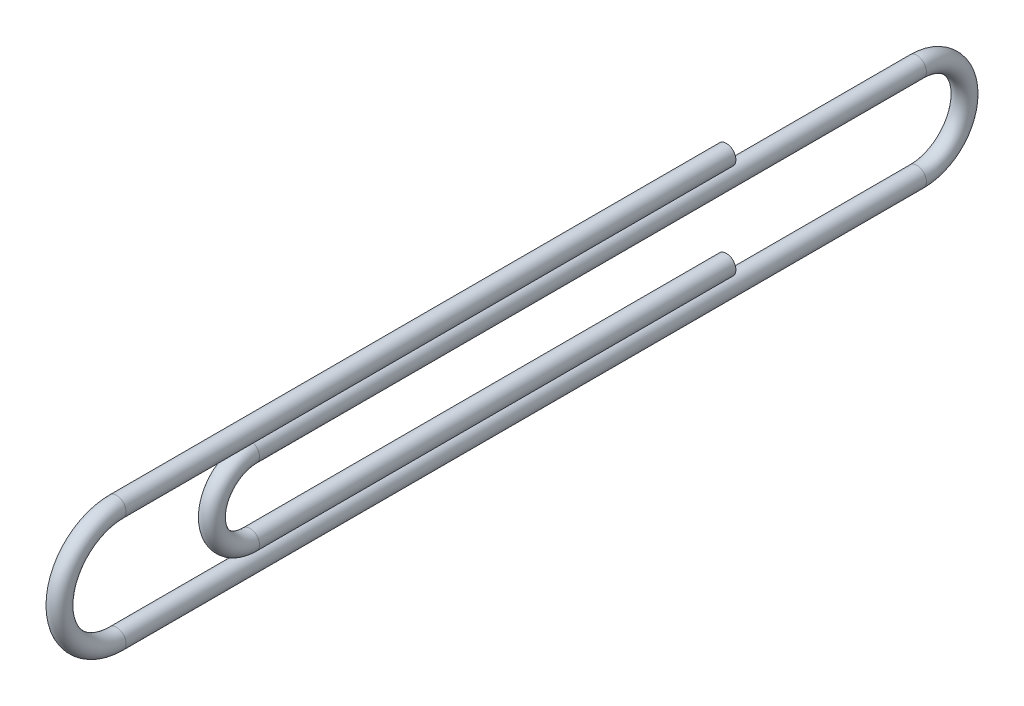
ISO-10303-21;
HEADER;
FILE_DESCRIPTION(('STEP AP214'),'2;1');
FILE_NAME('part.step','',(''),(''),'','','');
FILE_SCHEMA(('AUTOMOTIVE_DESIGN { 1 0 10303 214 1 1 1 1 }'));
ENDSEC;
DATA;
#1=APPLICATION_CONTEXT('core data for automotive mechanical design processes');
#2=APPLICATION_PROTOCOL_DEFINITION('international standard','automotive_design',2000,#1);
#3=PRODUCT_CONTEXT('',#1,'mechanical');
#4=PRODUCT('Part','Part','',(#3));
#5=PRODUCT_RELATED_PRODUCT_CATEGORY('part','',(#4));
#6=PRODUCT_DEFINITION_FORMATION('','',#4);
#7=PRODUCT_DEFINITION_CONTEXT('part definition',#1,'design');
#8=PRODUCT_DEFINITION('design','',#6,#7);
#9=PRODUCT_DEFINITION_SHAPE('','',#8);
#10=(LENGTH_UNIT() NAMED_UNIT(*) SI_UNIT(.MILLI.,.METRE.));
#11=(NAMED_UNIT(*) PLANE_ANGLE_UNIT() SI_UNIT($,.RADIAN.));
#12=(NAMED_UNIT(*) SI_UNIT($,.STERADIAN.) SOLID_ANGLE_UNIT());
#13=UNCERTAINTY_MEASURE_WITH_UNIT(LENGTH_MEASURE(1.E-05),#10,'distance_accuracy_value','');
#14=(GEOMETRIC_REPRESENTATION_CONTEXT(3) GLOBAL_UNCERTAINTY_ASSIGNED_CONTEXT((#13)) GLOBAL_UNIT_ASSIGNED_CONTEXT((#10,
#11,#12)) REPRESENTATION_CONTEXT('',''));
#15=CARTESIAN_POINT('',(0.,0.,0.));
#16=DIRECTION('',(0.,0.,1.));
#17=DIRECTION('',(1.,0.,0.));
#18=AXIS2_PLACEMENT_3D('',#15,#16,#17);
#19=CARTESIAN_POINT('',(0.,0.,0.));
#20=DIRECTION('',(0.,0.,-1.));
#21=DIRECTION('',(1.,0.,0.));
#22=AXIS2_PLACEMENT_3D('',#19,#20,#21);
#23=PLANE('',#22);
#24=CARTESIAN_POINT('',(0.,0.,0.));
#25=DIRECTION('',(0.,0.,-1.));
#26=DIRECTION('',(1.,0.,0.));
#27=AXIS2_PLACEMENT_3D('',#24,#25,#26);
#28=CIRCLE('',#27,0.49995);
#29=CARTESIAN_POINT('',(0.49995,0.,0.));
#30=VERTEX_POINT('',#29);
#31=EDGE_CURVE('E90',#30,#30,#28,.T.);
#32=ORIENTED_EDGE('',*,*,#31,.T.);
#33=EDGE_LOOP('',(#32));
#34=FACE_BOUND('',#33,.T.);
#35=ADVANCED_FACE('F55',(#34),#23,.T.);
#36=CARTESIAN_POINT('',(0.,-5.,0.));
#37=DIRECTION('',(0.,0.,1.));
#38=DIRECTION('',(1.,0.,0.));
#39=AXIS2_PLACEMENT_3D('',#36,#37,#38);
#40=PLANE('',#39);
#41=CARTESIAN_POINT('',(0.,-5.,0.));
#42=DIRECTION('',(0.,0.,1.));
#43=DIRECTION('',(1.,0.,0.));
#44=AXIS2_PLACEMENT_3D('',#41,#42,#43);
#45=CIRCLE('',#44,0.49995);
#46=CARTESIAN_POINT('',(0.49995,-5.,0.));
#47=VERTEX_POINT('',#46);
#48=EDGE_CURVE('E11',#47,#47,#45,.T.);
#49=ORIENTED_EDGE('',*,*,#48,.F.);
#50=EDGE_LOOP('',(#49));
#51=FACE_BOUND('',#50,.T.);
#52=ADVANCED_FACE('F99',(#51),#40,.F.);
#53=CARTESIAN_POINT('',(0.,0.,0.));
#54=DIRECTION('',(0.,0.,1.));
#55=DIRECTION('',(1.,0.,0.));
#56=AXIS2_PLACEMENT_3D('',#53,#54,#55);
#57=CYLINDRICAL_SURFACE('',#56,0.49995);
#58=CARTESIAN_POINT('',(0.,0.,32.));
#59=DIRECTION('',(0.,0.,-1.));
#60=DIRECTION('',(1.,0.,0.));
#61=AXIS2_PLACEMENT_3D('',#58,#59,#60);
#62=CIRCLE('',#61,0.49995);
#63=CARTESIAN_POINT('',(0.,0.49995,32.));
#64=VERTEX_POINT('',#63);
#65=EDGE_CURVE('E86',#64,#64,#62,.T.);
#66=ORIENTED_EDGE('',*,*,#65,.T.);
#67=EDGE_LOOP('',(#66));
#68=FACE_BOUND('',#67,.T.);
#69=ORIENTED_EDGE('',*,*,#31,.F.);
#70=EDGE_LOOP('',(#69));
#71=FACE_BOUND('',#70,.T.);
#72=ADVANCED_FACE('F96',(#68,#71),#57,.T.);
#73=CARTESIAN_POINT('',(0.,-3.,32.));
#74=DIRECTION('',(1.,0.,0.));
#75=DIRECTION('',(0.,0.,-1.));
#76=AXIS2_PLACEMENT_3D('',#73,#74,#75);
#77=TOROIDAL_SURFACE('',#76,3.,0.49995);
#78=CARTESIAN_POINT('',(0.,-6.,32.));
#79=DIRECTION('',(0.,0.,1.));
#80=DIRECTION('',(1.,0.,0.));
#81=AXIS2_PLACEMENT_3D('',#78,#79,#80);
#82=CIRCLE('',#81,0.49995);
#83=CARTESIAN_POINT('',(0.,-6.49995,32.));
#84=VERTEX_POINT('',#83);
#85=EDGE_CURVE('E82',#84,#84,#82,.T.);
#86=CARTESIAN_POINT('',(0.,-3.,32.));
#87=DIRECTION('',(1.,0.,0.));
#88=DIRECTION('',(0.,0.,-1.));
#89=AXIS2_PLACEMENT_3D('',#86,#87,#88);
#90=CIRCLE('',#89,3.49995);
#91=EDGE_CURVE('',#64,#84,#90,.T.);
#92=ORIENTED_EDGE('',*,*,#65,.F.);
#93=ORIENTED_EDGE('',*,*,#85,.T.);
#94=ORIENTED_EDGE('',*,*,#91,.T.);
#95=ORIENTED_EDGE('',*,*,#91,.F.);
#96=EDGE_LOOP('',(#92,#94,#93,#95));
#97=FACE_BOUND('',#96,.T.);
#98=ADVANCED_FACE('F98',(#97),#77,.T.);
#99=CARTESIAN_POINT('',(0.,-6.,32.));
#100=DIRECTION('',(0.,0.,-1.));
#101=DIRECTION('',(0.,1.,0.));
#102=AXIS2_PLACEMENT_3D('',#99,#100,#101);
#103=CYLINDRICAL_SURFACE('',#102,0.49995);
#104=CARTESIAN_POINT('',(0.,-6.,-9.99999999999999));
#105=DIRECTION('',(0.,0.,1.));
#106=DIRECTION('',(1.,0.,0.));
#107=AXIS2_PLACEMENT_3D('',#104,#105,#106);
#108=CIRCLE('',#107,0.49995);
#109=CARTESIAN_POINT('',(0.,-6.49995,-9.99999999999998));
#110=VERTEX_POINT('',#109);
#111=EDGE_CURVE('E78',#110,#110,#108,.T.);
#112=ORIENTED_EDGE('',*,*,#111,.T.);
#113=EDGE_LOOP('',(#112));
#114=FACE_BOUND('',#113,.T.);
#115=ORIENTED_EDGE('',*,*,#85,.F.);
#116=EDGE_LOOP('',(#115));
#117=FACE_BOUND('',#116,.T.);
#118=ADVANCED_FACE('F106',(#114,#117),#103,.T.);
#119=CARTESIAN_POINT('',(0.,-3.5,-10.));
#120=DIRECTION('',(1.,0.,0.));
#121=DIRECTION('',(0.,0.,-1.));
#122=AXIS2_PLACEMENT_3D('',#119,#120,#121);
#123=TOROIDAL_SURFACE('',#122,2.5,0.49995);
#124=CARTESIAN_POINT('',(0.,-1.,-10.));
#125=DIRECTION('',(0.,0.,-1.));
#126=DIRECTION('',(1.,0.,0.));
#127=AXIS2_PLACEMENT_3D('',#124,#125,#126);
#128=CIRCLE('',#127,0.49995);
#129=CARTESIAN_POINT('',(0.,-0.500050000000002,-10.));
#130=VERTEX_POINT('',#129);
#131=EDGE_CURVE('E72',#130,#130,#128,.T.);
#132=CARTESIAN_POINT('',(0.,-3.5,-10.));
#133=DIRECTION('',(1.,0.,0.));
#134=DIRECTION('',(0.,0.,-1.));
#135=AXIS2_PLACEMENT_3D('',#132,#133,#134);
#136=CIRCLE('',#135,2.99995);
#137=EDGE_CURVE('',#110,#130,#136,.T.);
#138=ORIENTED_EDGE('',*,*,#111,.F.);
#139=ORIENTED_EDGE('',*,*,#131,.T.);
#140=ORIENTED_EDGE('',*,*,#137,.T.);
#141=ORIENTED_EDGE('',*,*,#137,.F.);
#142=EDGE_LOOP('',(#138,#140,#139,#141));
#143=FACE_BOUND('',#142,.T.);
#144=ADVANCED_FACE('F123',(#143),#123,.T.);
#145=CARTESIAN_POINT('',(0.,-0.999999999999998,-10.));
#146=DIRECTION('',(0.,0.,1.));
#147=DIRECTION('',(0.,-1.,0.));
#148=AXIS2_PLACEMENT_3D('',#145,#146,#147);
#149=CYLINDRICAL_SURFACE('',#148,0.49995);
#150=CARTESIAN_POINT('',(0.,-1.,25.));
#151=DIRECTION('',(0.,0.,-1.));
#152=DIRECTION('',(1.,0.,0.));
#153=AXIS2_PLACEMENT_3D('',#150,#151,#152);
#154=CIRCLE('',#153,0.49995);
#155=CARTESIAN_POINT('',(0.,-0.500050000000003,25.));
#156=VERTEX_POINT('',#155);
#157=EDGE_CURVE('E67',#156,#156,#154,.T.);
#158=ORIENTED_EDGE('',*,*,#157,.T.);
#159=EDGE_LOOP('',(#158));
#160=FACE_BOUND('',#159,.T.);
#161=ORIENTED_EDGE('',*,*,#131,.F.);
#162=EDGE_LOOP('',(#161));
#163=FACE_BOUND('',#162,.T.);
#164=ADVANCED_FACE('F117',(#160,#163),#149,.T.);
#165=CARTESIAN_POINT('',(0.,-3.,25.));
#166=DIRECTION('',(1.,0.,0.));
#167=DIRECTION('',(0.,0.,-1.));
#168=AXIS2_PLACEMENT_3D('',#165,#166,#167);
#169=TOROIDAL_SURFACE('',#168,2.,0.49995);
#170=CARTESIAN_POINT('',(0.,-5.,25.));
#171=DIRECTION('',(0.,0.,1.));
#172=DIRECTION('',(1.,0.,0.));
#173=AXIS2_PLACEMENT_3D('',#170,#171,#172);
#174=CIRCLE('',#173,0.49995);
#175=CARTESIAN_POINT('',(0.,-5.49995,25.));
#176=VERTEX_POINT('',#175);
#177=EDGE_CURVE('E62',#176,#176,#174,.T.);
#178=CARTESIAN_POINT('',(0.,-3.,25.));
#179=DIRECTION('',(1.,0.,0.));
#180=DIRECTION('',(0.,0.,-1.));
#181=AXIS2_PLACEMENT_3D('',#178,#179,#180);
#182=CIRCLE('',#181,2.49995);
#183=EDGE_CURVE('',#156,#176,#182,.T.);
#184=ORIENTED_EDGE('',*,*,#157,.F.);
#185=ORIENTED_EDGE('',*,*,#177,.T.);
#186=ORIENTED_EDGE('',*,*,#183,.T.);
#187=ORIENTED_EDGE('',*,*,#183,.F.);
#188=EDGE_LOOP('',(#184,#186,#185,#187));
#189=FACE_BOUND('',#188,.T.);
#190=ADVANCED_FACE('F112',(#189),#169,.T.);
#191=CARTESIAN_POINT('',(0.,-5.,25.));
#192=DIRECTION('',(0.,0.,-1.));
#193=DIRECTION('',(0.,1.,0.));
#194=AXIS2_PLACEMENT_3D('',#191,#192,#193);
#195=CYLINDRICAL_SURFACE('',#194,0.49995);
#196=ORIENTED_EDGE('',*,*,#48,.T.);
#197=EDGE_LOOP('',(#196));
#198=FACE_BOUND('',#197,.T.);
#199=ORIENTED_EDGE('',*,*,#177,.F.);
#200=EDGE_LOOP('',(#199));
#201=FACE_BOUND('',#200,.T.);
#202=ADVANCED_FACE('F110',(#198,#201),#195,.T.);
#203=CLOSED_SHELL('',(#35,#52,#72,#98,#118,#144,#164,#190,#202));
#204=MANIFOLD_SOLID_BREP('B2',#203);
#205=ADVANCED_BREP_SHAPE_REPRESENTATION('',(#18,#204),#14);
#206=SHAPE_DEFINITION_REPRESENTATION(#9,#205);
ENDSEC;
END-ISO-10303-21;
